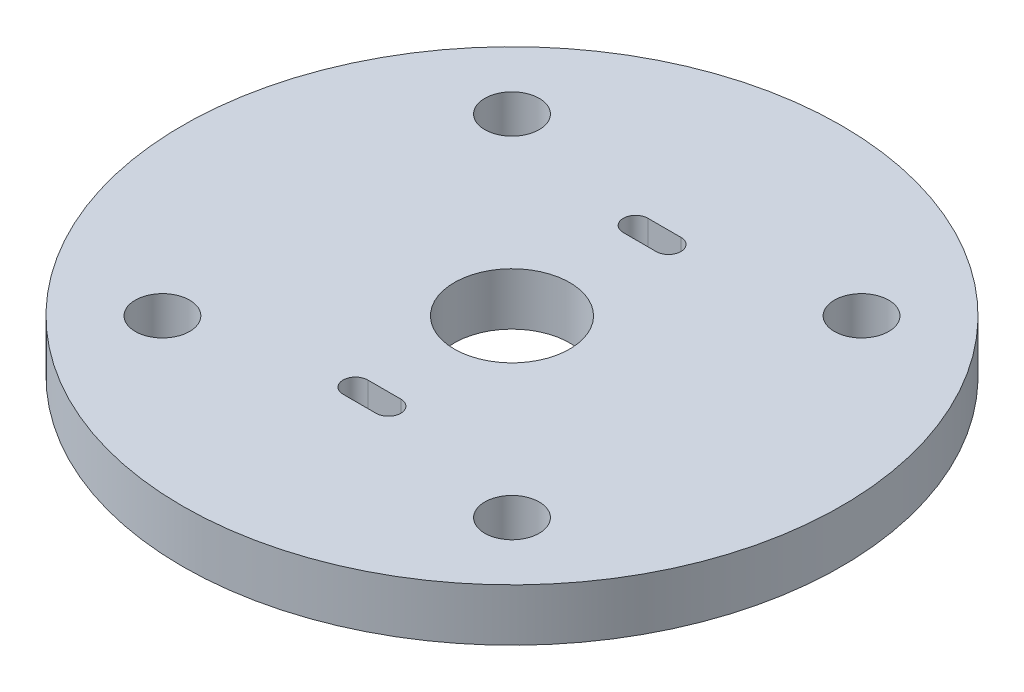
ISO-10303-21;
HEADER;
FILE_DESCRIPTION(('STEP AP214'),'2;1');
FILE_NAME('part.step','',(''),(''),'','','');
FILE_SCHEMA(('AUTOMOTIVE_DESIGN { 1 0 10303 214 1 1 1 1 }'));
ENDSEC;
DATA;
#1=APPLICATION_CONTEXT('core data for automotive mechanical design processes');
#2=APPLICATION_PROTOCOL_DEFINITION('international standard','automotive_design',2000,#1);
#3=PRODUCT_CONTEXT('',#1,'mechanical');
#4=PRODUCT('Part','Part','',(#3));
#5=PRODUCT_RELATED_PRODUCT_CATEGORY('part','',(#4));
#6=PRODUCT_DEFINITION_FORMATION('','',#4);
#7=PRODUCT_DEFINITION_CONTEXT('part definition',#1,'design');
#8=PRODUCT_DEFINITION('design','',#6,#7);
#9=PRODUCT_DEFINITION_SHAPE('','',#8);
#10=(LENGTH_UNIT() NAMED_UNIT(*) SI_UNIT(.MILLI.,.METRE.));
#11=(NAMED_UNIT(*) PLANE_ANGLE_UNIT() SI_UNIT($,.RADIAN.));
#12=(NAMED_UNIT(*) SI_UNIT($,.STERADIAN.) SOLID_ANGLE_UNIT());
#13=UNCERTAINTY_MEASURE_WITH_UNIT(LENGTH_MEASURE(1.E-05),#10,'distance_accuracy_value','');
#14=(GEOMETRIC_REPRESENTATION_CONTEXT(3) GLOBAL_UNCERTAINTY_ASSIGNED_CONTEXT((#13)) GLOBAL_UNIT_ASSIGNED_CONTEXT((#10,
#11,#12)) REPRESENTATION_CONTEXT('',''));
#15=CARTESIAN_POINT('',(0.,0.,0.));
#16=DIRECTION('',(0.,0.,1.));
#17=DIRECTION('',(1.,0.,0.));
#18=AXIS2_PLACEMENT_3D('',#15,#16,#17);
#19=CARTESIAN_POINT('',(10.6066017177982,3.175,-10.6066017177982));
#20=DIRECTION('',(0.,1.,0.));
#21=DIRECTION('',(0.,0.,1.));
#22=AXIS2_PLACEMENT_3D('',#19,#20,#21);
#23=PLANE('',#22);
#24=CARTESIAN_POINT('',(9.60660171779821,3.175,-2.10660169979821));
#25=DIRECTION('',(0.,1.,0.));
#26=DIRECTION('',(0.,0.,-1.));
#27=AXIS2_PLACEMENT_3D('',#24,#25,#26);
#28=CIRCLE('',#27,0.749999999999998);
#29=CARTESIAN_POINT('',(9.60660171779821,3.175,-2.85660169979821));
#30=VERTEX_POINT('',#29);
#31=CARTESIAN_POINT('',(9.60660171779821,3.175,-1.35660169979821));
#32=VERTEX_POINT('',#31);
#33=EDGE_CURVE('E48',#30,#32,#28,.T.);
#34=ORIENTED_EDGE('',*,*,#33,.F.);
#35=DIRECTION('',(-1.,0.,0.));
#36=VECTOR('',#35,1.);
#37=CARTESIAN_POINT('',(9.60660171779821,3.175,-2.85660169979821));
#38=LINE('',#37,#36);
#39=CARTESIAN_POINT('',(11.6066017177982,3.175,-2.85660169979821));
#40=VERTEX_POINT('',#39);
#41=EDGE_CURVE('E116',#40,#30,#38,.T.);
#42=ORIENTED_EDGE('',*,*,#41,.F.);
#43=CARTESIAN_POINT('',(11.6066017177982,3.175,-2.10660169979821));
#44=DIRECTION('',(0.,1.,0.));
#45=DIRECTION('',(0.,0.,-1.));
#46=AXIS2_PLACEMENT_3D('',#43,#44,#45);
#47=CIRCLE('',#46,0.749999999999998);
#48=CARTESIAN_POINT('',(11.6066017177982,3.175,-1.35660169979821));
#49=VERTEX_POINT('',#48);
#50=EDGE_CURVE('E119',#49,#40,#47,.T.);
#51=ORIENTED_EDGE('',*,*,#50,.F.);
#52=DIRECTION('',(1.,0.,0.));
#53=VECTOR('',#52,1.);
#54=CARTESIAN_POINT('',(9.60660171779821,3.175,-1.35660169979821));
#55=LINE('',#54,#53);
#56=EDGE_CURVE('E125',#32,#49,#55,.T.);
#57=ORIENTED_EDGE('',*,*,#56,.F.);
#58=EDGE_LOOP('',(#34,#42,#51,#57));
#59=FACE_BOUND('',#58,.T.);
#60=CARTESIAN_POINT('',(9.60660171779821,3.175,-19.1066017357982));
#61=DIRECTION('',(0.,1.,0.));
#62=DIRECTION('',(0.,0.,1.));
#63=AXIS2_PLACEMENT_3D('',#60,#61,#62);
#64=CIRCLE('',#63,0.749999999999997);
#65=CARTESIAN_POINT('',(9.60660171779821,3.175,-19.8566017357982));
#66=VERTEX_POINT('',#65);
#67=CARTESIAN_POINT('',(9.60660171779821,3.175,-18.3566017357982));
#68=VERTEX_POINT('',#67);
#69=EDGE_CURVE('E131',#66,#68,#64,.T.);
#70=ORIENTED_EDGE('',*,*,#69,.F.);
#71=DIRECTION('',(-1.,0.,0.));
#72=VECTOR('',#71,1.);
#73=CARTESIAN_POINT('',(9.60660171779821,3.175,-19.8566017357982));
#74=LINE('',#73,#72);
#75=CARTESIAN_POINT('',(11.6066017177982,3.175,-19.8566017357982));
#76=VERTEX_POINT('',#75);
#77=EDGE_CURVE('E139',#76,#66,#74,.T.);
#78=ORIENTED_EDGE('',*,*,#77,.F.);
#79=CARTESIAN_POINT('',(11.6066017177982,3.175,-19.1066017357982));
#80=DIRECTION('',(0.,1.,0.));
#81=DIRECTION('',(0.,0.,1.));
#82=AXIS2_PLACEMENT_3D('',#79,#80,#81);
#83=CIRCLE('',#82,0.749999999999997);
#84=CARTESIAN_POINT('',(11.6066017177982,3.175,-18.3566017357982));
#85=VERTEX_POINT('',#84);
#86=EDGE_CURVE('E153',#85,#76,#83,.T.);
#87=ORIENTED_EDGE('',*,*,#86,.F.);
#88=DIRECTION('',(1.,0.,0.));
#89=VECTOR('',#88,1.);
#90=CARTESIAN_POINT('',(9.60660171779821,3.175,-18.3566017357982));
#91=LINE('',#90,#89);
#92=EDGE_CURVE('E150',#68,#85,#91,.T.);
#93=ORIENTED_EDGE('',*,*,#92,.F.);
#94=EDGE_LOOP('',(#70,#78,#87,#93));
#95=FACE_BOUND('',#94,.T.);
#96=CARTESIAN_POINT('',(21.2132034355964,3.175,0.));
#97=DIRECTION('',(0.,1.,0.));
#98=DIRECTION('',(0.,0.,1.));
#99=AXIS2_PLACEMENT_3D('',#96,#97,#98);
#100=CIRCLE('',#99,1.65);
#101=CARTESIAN_POINT('',(21.2132034355964,3.175,1.65));
#102=VERTEX_POINT('',#101);
#103=EDGE_CURVE('E173',#102,#102,#100,.T.);
#104=ORIENTED_EDGE('',*,*,#103,.F.);
#105=EDGE_LOOP('',(#104));
#106=FACE_BOUND('',#105,.T.);
#107=CARTESIAN_POINT('',(0.,3.175,-21.2132034355964));
#108=DIRECTION('',(0.,1.,0.));
#109=DIRECTION('',(0.,0.,1.));
#110=AXIS2_PLACEMENT_3D('',#107,#108,#109);
#111=CIRCLE('',#110,1.65);
#112=CARTESIAN_POINT('',(0.,3.175,-19.5632034355964));
#113=VERTEX_POINT('',#112);
#114=EDGE_CURVE('E185',#113,#113,#111,.T.);
#115=ORIENTED_EDGE('',*,*,#114,.F.);
#116=EDGE_LOOP('',(#115));
#117=FACE_BOUND('',#116,.T.);
#118=CARTESIAN_POINT('',(10.6066017177982,3.175,-10.6066017177982));
#119=DIRECTION('',(0.,1.,0.));
#120=DIRECTION('',(0.,0.,1.));
#121=AXIS2_PLACEMENT_3D('',#118,#119,#120);
#122=CIRCLE('',#121,20.);
#123=CARTESIAN_POINT('',(10.6066017177982,3.175,9.39339828220179));
#124=VERTEX_POINT('',#123);
#125=EDGE_CURVE('E11',#124,#124,#122,.T.);
#126=ORIENTED_EDGE('',*,*,#125,.T.);
#127=EDGE_LOOP('',(#126));
#128=FACE_BOUND('',#127,.T.);
#129=CARTESIAN_POINT('',(10.6066017177982,3.175,-10.6066017177982));
#130=DIRECTION('',(0.,1.,0.));
#131=DIRECTION('',(0.,0.,1.));
#132=AXIS2_PLACEMENT_3D('',#129,#130,#131);
#133=CIRCLE('',#132,3.5);
#134=CARTESIAN_POINT('',(10.6066017177982,3.175,-7.10660171779821));
#135=VERTEX_POINT('',#134);
#136=EDGE_CURVE('E191',#135,#135,#133,.T.);
#137=ORIENTED_EDGE('',*,*,#136,.F.);
#138=EDGE_LOOP('',(#137));
#139=FACE_BOUND('',#138,.T.);
#140=CARTESIAN_POINT('',(21.2132034355964,3.175,-21.2132034355964));
#141=DIRECTION('',(0.,1.,0.));
#142=DIRECTION('',(0.,0.,1.));
#143=AXIS2_PLACEMENT_3D('',#140,#141,#142);
#144=CIRCLE('',#143,1.65);
#145=CARTESIAN_POINT('',(21.2132034355964,3.175,-19.5632034355964));
#146=VERTEX_POINT('',#145);
#147=EDGE_CURVE('E179',#146,#146,#144,.T.);
#148=ORIENTED_EDGE('',*,*,#147,.F.);
#149=EDGE_LOOP('',(#148));
#150=FACE_BOUND('',#149,.T.);
#151=CARTESIAN_POINT('',(0.,3.175,0.));
#152=DIRECTION('',(0.,1.,0.));
#153=DIRECTION('',(0.,0.,1.));
#154=AXIS2_PLACEMENT_3D('',#151,#152,#153);
#155=CIRCLE('',#154,1.65);
#156=CARTESIAN_POINT('',(0.,3.175,1.65));
#157=VERTEX_POINT('',#156);
#158=EDGE_CURVE('E167',#157,#157,#155,.T.);
#159=ORIENTED_EDGE('',*,*,#158,.F.);
#160=EDGE_LOOP('',(#159));
#161=FACE_BOUND('',#160,.T.);
#162=ADVANCED_FACE('F33',(#59,#95,#106,#117,#128,#139,#150,#161),#23,.T.);
#163=CARTESIAN_POINT('',(10.6066017177982,0.,-10.6066017177982));
#164=DIRECTION('',(0.,1.,0.));
#165=DIRECTION('',(0.,0.,1.));
#166=AXIS2_PLACEMENT_3D('',#163,#164,#165);
#167=PLANE('',#166);
#168=DIRECTION('',(-1.,0.,0.));
#169=VECTOR('',#168,1.);
#170=CARTESIAN_POINT('',(9.60660171779821,0.,-2.85660169979821));
#171=LINE('',#170,#169);
#172=CARTESIAN_POINT('',(11.6066017177982,0.,-2.85660169979821));
#173=VERTEX_POINT('',#172);
#174=CARTESIAN_POINT('',(9.60660171779821,0.,-2.85660169979821));
#175=VERTEX_POINT('',#174);
#176=EDGE_CURVE('E106',#173,#175,#171,.T.);
#177=ORIENTED_EDGE('',*,*,#176,.T.);
#178=CARTESIAN_POINT('',(9.60660171779821,0.,-2.10660169979821));
#179=DIRECTION('',(0.,1.,0.));
#180=DIRECTION('',(0.,0.,-1.));
#181=AXIS2_PLACEMENT_3D('',#178,#179,#180);
#182=CIRCLE('',#181,0.749999999999998);
#183=CARTESIAN_POINT('',(9.60660171779821,0.,-1.35660169979821));
#184=VERTEX_POINT('',#183);
#185=EDGE_CURVE('E100',#175,#184,#182,.T.);
#186=ORIENTED_EDGE('',*,*,#185,.T.);
#187=DIRECTION('',(1.,0.,0.));
#188=VECTOR('',#187,1.);
#189=CARTESIAN_POINT('',(9.60660171779821,0.,-1.35660169979821));
#190=LINE('',#189,#188);
#191=CARTESIAN_POINT('',(11.6066017177982,0.,-1.35660169979821));
#192=VERTEX_POINT('',#191);
#193=EDGE_CURVE('E109',#184,#192,#190,.T.);
#194=ORIENTED_EDGE('',*,*,#193,.T.);
#195=CARTESIAN_POINT('',(11.6066017177982,0.,-2.10660169979821));
#196=DIRECTION('',(0.,1.,0.));
#197=DIRECTION('',(0.,0.,-1.));
#198=AXIS2_PLACEMENT_3D('',#195,#196,#197);
#199=CIRCLE('',#198,0.749999999999998);
#200=EDGE_CURVE('E56',#192,#173,#199,.T.);
#201=ORIENTED_EDGE('',*,*,#200,.T.);
#202=EDGE_LOOP('',(#177,#186,#194,#201));
#203=FACE_BOUND('',#202,.T.);
#204=DIRECTION('',(-1.,0.,0.));
#205=VECTOR('',#204,1.);
#206=CARTESIAN_POINT('',(9.60660171779821,0.,-19.8566017357982));
#207=LINE('',#206,#205);
#208=CARTESIAN_POINT('',(11.6066017177982,0.,-19.8566017357982));
#209=VERTEX_POINT('',#208);
#210=CARTESIAN_POINT('',(9.60660171779821,0.,-19.8566017357982));
#211=VERTEX_POINT('',#210);
#212=EDGE_CURVE('E145',#209,#211,#207,.T.);
#213=ORIENTED_EDGE('',*,*,#212,.T.);
#214=CARTESIAN_POINT('',(9.60660171779821,0.,-19.1066017357982));
#215=DIRECTION('',(0.,1.,0.));
#216=DIRECTION('',(0.,0.,1.));
#217=AXIS2_PLACEMENT_3D('',#214,#215,#216);
#218=CIRCLE('',#217,0.749999999999997);
#219=CARTESIAN_POINT('',(9.60660171779821,0.,-18.3566017357982));
#220=VERTEX_POINT('',#219);
#221=EDGE_CURVE('E135',#211,#220,#218,.T.);
#222=ORIENTED_EDGE('',*,*,#221,.T.);
#223=DIRECTION('',(1.,0.,0.));
#224=VECTOR('',#223,1.);
#225=CARTESIAN_POINT('',(9.60660171779821,0.,-18.3566017357982));
#226=LINE('',#225,#224);
#227=CARTESIAN_POINT('',(11.6066017177982,0.,-18.3566017357982));
#228=VERTEX_POINT('',#227);
#229=EDGE_CURVE('E138',#220,#228,#226,.T.);
#230=ORIENTED_EDGE('',*,*,#229,.T.);
#231=CARTESIAN_POINT('',(11.6066017177982,0.,-19.1066017357982));
#232=DIRECTION('',(0.,1.,0.));
#233=DIRECTION('',(0.,0.,1.));
#234=AXIS2_PLACEMENT_3D('',#231,#232,#233);
#235=CIRCLE('',#234,0.749999999999997);
#236=EDGE_CURVE('E142',#228,#209,#235,.T.);
#237=ORIENTED_EDGE('',*,*,#236,.T.);
#238=EDGE_LOOP('',(#213,#222,#230,#237));
#239=FACE_BOUND('',#238,.T.);
#240=CARTESIAN_POINT('',(21.2132034355964,0.,0.));
#241=DIRECTION('',(0.,1.,0.));
#242=DIRECTION('',(0.,0.,1.));
#243=AXIS2_PLACEMENT_3D('',#240,#241,#242);
#244=CIRCLE('',#243,1.65);
#245=CARTESIAN_POINT('',(21.2132034355964,0.,1.65));
#246=VERTEX_POINT('',#245);
#247=EDGE_CURVE('E170',#246,#246,#244,.T.);
#248=ORIENTED_EDGE('',*,*,#247,.T.);
#249=EDGE_LOOP('',(#248));
#250=FACE_BOUND('',#249,.T.);
#251=CARTESIAN_POINT('',(0.,0.,-21.2132034355964));
#252=DIRECTION('',(0.,1.,0.));
#253=DIRECTION('',(0.,0.,1.));
#254=AXIS2_PLACEMENT_3D('',#251,#252,#253);
#255=CIRCLE('',#254,1.65);
#256=CARTESIAN_POINT('',(0.,0.,-19.5632034355964));
#257=VERTEX_POINT('',#256);
#258=EDGE_CURVE('E182',#257,#257,#255,.T.);
#259=ORIENTED_EDGE('',*,*,#258,.T.);
#260=EDGE_LOOP('',(#259));
#261=FACE_BOUND('',#260,.T.);
#262=CARTESIAN_POINT('',(10.6066017177982,0.,-10.6066017177982));
#263=DIRECTION('',(0.,1.,0.));
#264=DIRECTION('',(0.,0.,1.));
#265=AXIS2_PLACEMENT_3D('',#262,#263,#264);
#266=CIRCLE('',#265,20.);
#267=CARTESIAN_POINT('',(10.6066017177982,0.,9.39339828220179));
#268=VERTEX_POINT('',#267);
#269=EDGE_CURVE('E37',#268,#268,#266,.T.);
#270=ORIENTED_EDGE('',*,*,#269,.F.);
#271=EDGE_LOOP('',(#270));
#272=FACE_BOUND('',#271,.T.);
#273=CARTESIAN_POINT('',(10.6066017177982,0.,-10.6066017177982));
#274=DIRECTION('',(0.,1.,0.));
#275=DIRECTION('',(0.,0.,1.));
#276=AXIS2_PLACEMENT_3D('',#273,#274,#275);
#277=CIRCLE('',#276,3.5);
#278=CARTESIAN_POINT('',(10.6066017177982,0.,-7.10660171779821));
#279=VERTEX_POINT('',#278);
#280=EDGE_CURVE('E188',#279,#279,#277,.T.);
#281=ORIENTED_EDGE('',*,*,#280,.T.);
#282=EDGE_LOOP('',(#281));
#283=FACE_BOUND('',#282,.T.);
#284=CARTESIAN_POINT('',(21.2132034355964,0.,-21.2132034355964));
#285=DIRECTION('',(0.,1.,0.));
#286=DIRECTION('',(0.,0.,1.));
#287=AXIS2_PLACEMENT_3D('',#284,#285,#286);
#288=CIRCLE('',#287,1.65);
#289=CARTESIAN_POINT('',(21.2132034355964,0.,-19.5632034355964));
#290=VERTEX_POINT('',#289);
#291=EDGE_CURVE('E176',#290,#290,#288,.T.);
#292=ORIENTED_EDGE('',*,*,#291,.T.);
#293=EDGE_LOOP('',(#292));
#294=FACE_BOUND('',#293,.T.);
#295=CARTESIAN_POINT('',(0.,0.,0.));
#296=DIRECTION('',(0.,1.,0.));
#297=DIRECTION('',(0.,0.,1.));
#298=AXIS2_PLACEMENT_3D('',#295,#296,#297);
#299=CIRCLE('',#298,1.65);
#300=CARTESIAN_POINT('',(0.,0.,1.65));
#301=VERTEX_POINT('',#300);
#302=EDGE_CURVE('E160',#301,#301,#299,.T.);
#303=ORIENTED_EDGE('',*,*,#302,.T.);
#304=EDGE_LOOP('',(#303));
#305=FACE_BOUND('',#304,.T.);
#306=ADVANCED_FACE('F113',(#203,#239,#250,#261,#272,#283,#294,#305),#167,.F.);
#307=CARTESIAN_POINT('',(10.6066017177982,3.175,-10.6066017177982));
#308=DIRECTION('',(0.,-1.,0.));
#309=DIRECTION('',(0.,0.,-1.));
#310=AXIS2_PLACEMENT_3D('',#307,#308,#309);
#311=CYLINDRICAL_SURFACE('',#310,20.);
#312=ORIENTED_EDGE('',*,*,#125,.F.);
#313=EDGE_LOOP('',(#312));
#314=FACE_BOUND('',#313,.T.);
#315=ORIENTED_EDGE('',*,*,#269,.T.);
#316=EDGE_LOOP('',(#315));
#317=FACE_BOUND('',#316,.T.);
#318=ADVANCED_FACE('F35',(#314,#317),#311,.T.);
#319=CARTESIAN_POINT('',(10.6066017177982,3.175,-10.6066017177982));
#320=DIRECTION('',(0.,-1.,0.));
#321=DIRECTION('',(0.,0.,-1.));
#322=AXIS2_PLACEMENT_3D('',#319,#320,#321);
#323=CYLINDRICAL_SURFACE('',#322,3.5);
#324=ORIENTED_EDGE('',*,*,#136,.T.);
#325=EDGE_LOOP('',(#324));
#326=FACE_BOUND('',#325,.T.);
#327=ORIENTED_EDGE('',*,*,#280,.F.);
#328=EDGE_LOOP('',(#327));
#329=FACE_BOUND('',#328,.T.);
#330=ADVANCED_FACE('F199',(#326,#329),#323,.F.);
#331=CARTESIAN_POINT('',(0.,3.175,-21.2132034355964));
#332=DIRECTION('',(0.,-1.,0.));
#333=DIRECTION('',(0.,0.,-1.));
#334=AXIS2_PLACEMENT_3D('',#331,#332,#333);
#335=CYLINDRICAL_SURFACE('',#334,1.65);
#336=ORIENTED_EDGE('',*,*,#114,.T.);
#337=EDGE_LOOP('',(#336));
#338=FACE_BOUND('',#337,.T.);
#339=ORIENTED_EDGE('',*,*,#258,.F.);
#340=EDGE_LOOP('',(#339));
#341=FACE_BOUND('',#340,.T.);
#342=ADVANCED_FACE('F201',(#338,#341),#335,.F.);
#343=CARTESIAN_POINT('',(21.2132034355964,3.175,-21.2132034355964));
#344=DIRECTION('',(0.,-1.,0.));
#345=DIRECTION('',(0.,0.,-1.));
#346=AXIS2_PLACEMENT_3D('',#343,#344,#345);
#347=CYLINDRICAL_SURFACE('',#346,1.65);
#348=ORIENTED_EDGE('',*,*,#147,.T.);
#349=EDGE_LOOP('',(#348));
#350=FACE_BOUND('',#349,.T.);
#351=ORIENTED_EDGE('',*,*,#291,.F.);
#352=EDGE_LOOP('',(#351));
#353=FACE_BOUND('',#352,.T.);
#354=ADVANCED_FACE('F208',(#350,#353),#347,.F.);
#355=CARTESIAN_POINT('',(21.2132034355964,3.175,0.));
#356=DIRECTION('',(0.,-1.,0.));
#357=DIRECTION('',(0.,0.,-1.));
#358=AXIS2_PLACEMENT_3D('',#355,#356,#357);
#359=CYLINDRICAL_SURFACE('',#358,1.65);
#360=ORIENTED_EDGE('',*,*,#103,.T.);
#361=EDGE_LOOP('',(#360));
#362=FACE_BOUND('',#361,.T.);
#363=ORIENTED_EDGE('',*,*,#247,.F.);
#364=EDGE_LOOP('',(#363));
#365=FACE_BOUND('',#364,.T.);
#366=ADVANCED_FACE('F240',(#362,#365),#359,.F.);
#367=CARTESIAN_POINT('',(0.,3.175,0.));
#368=DIRECTION('',(0.,-1.,0.));
#369=DIRECTION('',(0.,0.,-1.));
#370=AXIS2_PLACEMENT_3D('',#367,#368,#369);
#371=CYLINDRICAL_SURFACE('',#370,1.65);
#372=ORIENTED_EDGE('',*,*,#158,.T.);
#373=EDGE_LOOP('',(#372));
#374=FACE_BOUND('',#373,.T.);
#375=ORIENTED_EDGE('',*,*,#302,.F.);
#376=EDGE_LOOP('',(#375));
#377=FACE_BOUND('',#376,.T.);
#378=ADVANCED_FACE('F236',(#374,#377),#371,.F.);
#379=CARTESIAN_POINT('',(9.60660171779821,0.,-19.1066017357982));
#380=DIRECTION('',(0.,1.,0.));
#381=DIRECTION('',(0.,0.,1.));
#382=AXIS2_PLACEMENT_3D('',#379,#380,#381);
#383=CYLINDRICAL_SURFACE('',#382,0.749999999999997);
#384=ORIENTED_EDGE('',*,*,#69,.T.);
#385=DIRECTION('',(0.,1.,0.));
#386=VECTOR('',#385,1.);
#387=CARTESIAN_POINT('',(9.60660171779821,0.,-18.3566017357982));
#388=LINE('',#387,#386);
#389=EDGE_CURVE('E148',#220,#68,#388,.T.);
#390=ORIENTED_EDGE('',*,*,#389,.F.);
#391=ORIENTED_EDGE('',*,*,#221,.F.);
#392=DIRECTION('',(0.,1.,0.));
#393=VECTOR('',#392,1.);
#394=CARTESIAN_POINT('',(9.60660171779821,0.,-19.8566017357982));
#395=LINE('',#394,#393);
#396=EDGE_CURVE('E158',#211,#66,#395,.T.);
#397=ORIENTED_EDGE('',*,*,#396,.T.);
#398=EDGE_LOOP('',(#384,#390,#391,#397));
#399=FACE_BOUND('',#398,.T.);
#400=ADVANCED_FACE('F239',(#399),#383,.F.);
#401=CARTESIAN_POINT('',(9.60660171779821,0.,-19.8566017357982));
#402=DIRECTION('',(0.,0.,-1.));
#403=DIRECTION('',(-1.,0.,0.));
#404=AXIS2_PLACEMENT_3D('',#401,#402,#403);
#405=PLANE('',#404);
#406=ORIENTED_EDGE('',*,*,#77,.T.);
#407=ORIENTED_EDGE('',*,*,#396,.F.);
#408=ORIENTED_EDGE('',*,*,#212,.F.);
#409=DIRECTION('',(0.,1.,0.));
#410=VECTOR('',#409,1.);
#411=CARTESIAN_POINT('',(11.6066017177982,0.,-19.8566017357982));
#412=LINE('',#411,#410);
#413=EDGE_CURVE('E161',#209,#76,#412,.T.);
#414=ORIENTED_EDGE('',*,*,#413,.T.);
#415=EDGE_LOOP('',(#406,#407,#408,#414));
#416=FACE_BOUND('',#415,.T.);
#417=ADVANCED_FACE('F248',(#416),#405,.F.);
#418=CARTESIAN_POINT('',(11.6066017177982,0.,-19.1066017357982));
#419=DIRECTION('',(0.,1.,0.));
#420=DIRECTION('',(0.,0.,1.));
#421=AXIS2_PLACEMENT_3D('',#418,#419,#420);
#422=CYLINDRICAL_SURFACE('',#421,0.749999999999997);
#423=ORIENTED_EDGE('',*,*,#86,.T.);
#424=ORIENTED_EDGE('',*,*,#413,.F.);
#425=ORIENTED_EDGE('',*,*,#236,.F.);
#426=DIRECTION('',(0.,1.,0.));
#427=VECTOR('',#426,1.);
#428=CARTESIAN_POINT('',(11.6066017177982,0.,-18.3566017357982));
#429=LINE('',#428,#427);
#430=EDGE_CURVE('E163',#228,#85,#429,.T.);
#431=ORIENTED_EDGE('',*,*,#430,.T.);
#432=EDGE_LOOP('',(#423,#424,#425,#431));
#433=FACE_BOUND('',#432,.T.);
#434=ADVANCED_FACE('F297',(#433),#422,.F.);
#435=CARTESIAN_POINT('',(9.60660171779821,0.,-18.3566017357982));
#436=DIRECTION('',(0.,0.,1.));
#437=DIRECTION('',(1.,0.,0.));
#438=AXIS2_PLACEMENT_3D('',#435,#436,#437);
#439=PLANE('',#438);
#440=ORIENTED_EDGE('',*,*,#92,.T.);
#441=ORIENTED_EDGE('',*,*,#430,.F.);
#442=ORIENTED_EDGE('',*,*,#229,.F.);
#443=ORIENTED_EDGE('',*,*,#389,.T.);
#444=EDGE_LOOP('',(#440,#441,#442,#443));
#445=FACE_BOUND('',#444,.T.);
#446=ADVANCED_FACE('F307',(#445),#439,.F.);
#447=CARTESIAN_POINT('',(9.60660171779821,0.,-2.10660169979821));
#448=DIRECTION('',(0.,1.,0.));
#449=DIRECTION('',(0.,0.,1.));
#450=AXIS2_PLACEMENT_3D('',#447,#448,#449);
#451=CYLINDRICAL_SURFACE('',#450,0.749999999999998);
#452=ORIENTED_EDGE('',*,*,#33,.T.);
#453=DIRECTION('',(0.,1.,0.));
#454=VECTOR('',#453,1.);
#455=CARTESIAN_POINT('',(9.60660171779821,0.,-1.35660169979821));
#456=LINE('',#455,#454);
#457=EDGE_CURVE('E96',#184,#32,#456,.T.);
#458=ORIENTED_EDGE('',*,*,#457,.F.);
#459=ORIENTED_EDGE('',*,*,#185,.F.);
#460=DIRECTION('',(0.,1.,0.));
#461=VECTOR('',#460,1.);
#462=CARTESIAN_POINT('',(9.60660171779821,0.,-2.85660169979821));
#463=LINE('',#462,#461);
#464=EDGE_CURVE('E129',#175,#30,#463,.T.);
#465=ORIENTED_EDGE('',*,*,#464,.T.);
#466=EDGE_LOOP('',(#452,#458,#459,#465));
#467=FACE_BOUND('',#466,.T.);
#468=ADVANCED_FACE('F98',(#467),#451,.F.);
#469=CARTESIAN_POINT('',(9.60660171779821,0.,-2.85660169979821));
#470=DIRECTION('',(0.,0.,-1.));
#471=DIRECTION('',(-1.,0.,0.));
#472=AXIS2_PLACEMENT_3D('',#469,#470,#471);
#473=PLANE('',#472);
#474=ORIENTED_EDGE('',*,*,#41,.T.);
#475=ORIENTED_EDGE('',*,*,#464,.F.);
#476=ORIENTED_EDGE('',*,*,#176,.F.);
#477=DIRECTION('',(0.,1.,0.));
#478=VECTOR('',#477,1.);
#479=CARTESIAN_POINT('',(11.6066017177982,0.,-2.85660169979821));
#480=LINE('',#479,#478);
#481=EDGE_CURVE('E132',#173,#40,#480,.T.);
#482=ORIENTED_EDGE('',*,*,#481,.T.);
#483=EDGE_LOOP('',(#474,#475,#476,#482));
#484=FACE_BOUND('',#483,.T.);
#485=ADVANCED_FACE('F325',(#484),#473,.F.);
#486=CARTESIAN_POINT('',(11.6066017177982,0.,-2.10660169979821));
#487=DIRECTION('',(0.,1.,0.));
#488=DIRECTION('',(0.,0.,1.));
#489=AXIS2_PLACEMENT_3D('',#486,#487,#488);
#490=CYLINDRICAL_SURFACE('',#489,0.749999999999998);
#491=ORIENTED_EDGE('',*,*,#50,.T.);
#492=ORIENTED_EDGE('',*,*,#481,.F.);
#493=ORIENTED_EDGE('',*,*,#200,.F.);
#494=DIRECTION('',(0.,1.,0.));
#495=VECTOR('',#494,1.);
#496=CARTESIAN_POINT('',(11.6066017177982,0.,-1.35660169979821));
#497=LINE('',#496,#495);
#498=EDGE_CURVE('E105',#192,#49,#497,.T.);
#499=ORIENTED_EDGE('',*,*,#498,.T.);
#500=EDGE_LOOP('',(#491,#492,#493,#499));
#501=FACE_BOUND('',#500,.T.);
#502=ADVANCED_FACE('F334',(#501),#490,.F.);
#503=CARTESIAN_POINT('',(9.60660171779821,0.,-1.35660169979821));
#504=DIRECTION('',(0.,0.,1.));
#505=DIRECTION('',(1.,0.,0.));
#506=AXIS2_PLACEMENT_3D('',#503,#504,#505);
#507=PLANE('',#506);
#508=ORIENTED_EDGE('',*,*,#56,.T.);
#509=ORIENTED_EDGE('',*,*,#498,.F.);
#510=ORIENTED_EDGE('',*,*,#193,.F.);
#511=ORIENTED_EDGE('',*,*,#457,.T.);
#512=EDGE_LOOP('',(#508,#509,#510,#511));
#513=FACE_BOUND('',#512,.T.);
#514=ADVANCED_FACE('F110',(#513),#507,.F.);
#515=CLOSED_SHELL('',(#162,#306,#318,#330,#342,#354,#366,#378,#400,#417,#434,#446,#468,#485,
#502,#514));
#516=MANIFOLD_SOLID_BREP('B2',#515);
#517=ADVANCED_BREP_SHAPE_REPRESENTATION('',(#18,#516),#14);
#518=SHAPE_DEFINITION_REPRESENTATION(#9,#517);
ENDSEC;
END-ISO-10303-21;
